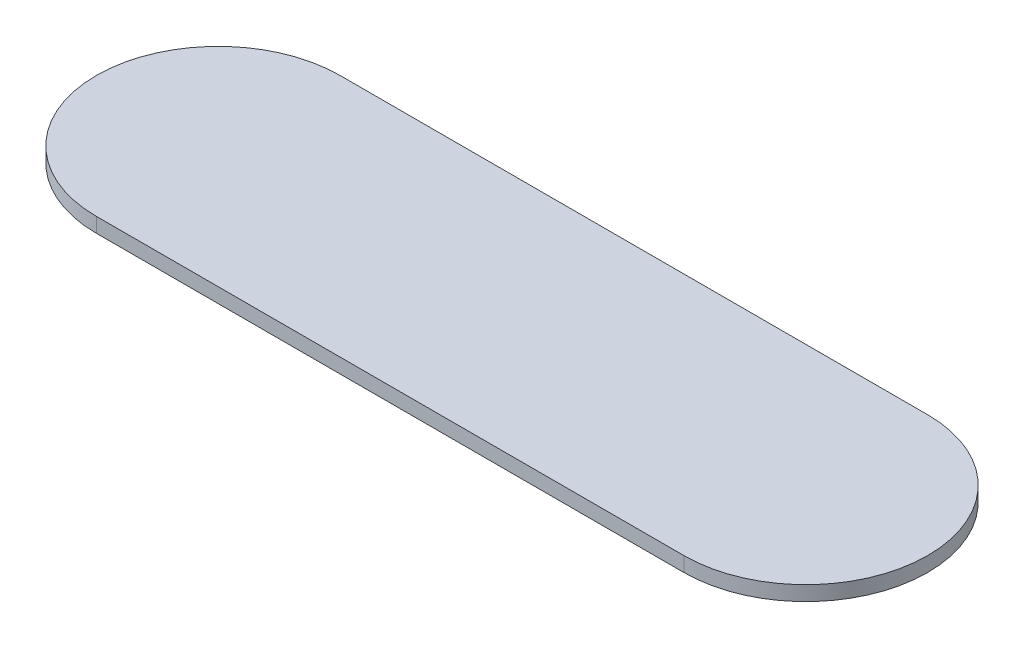
ISO-10303-21;
HEADER;
FILE_DESCRIPTION(('STEP AP214'),'2;1');
FILE_NAME('part.step','',(''),(''),'','','');
FILE_SCHEMA(('AUTOMOTIVE_DESIGN { 1 0 10303 214 1 1 1 1 }'));
ENDSEC;
DATA;
#1=APPLICATION_CONTEXT('core data for automotive mechanical design processes');
#2=APPLICATION_PROTOCOL_DEFINITION('international standard','automotive_design',2000,#1);
#3=PRODUCT_CONTEXT('',#1,'mechanical');
#4=PRODUCT('Part','Part','',(#3));
#5=PRODUCT_RELATED_PRODUCT_CATEGORY('part','',(#4));
#6=PRODUCT_DEFINITION_FORMATION('','',#4);
#7=PRODUCT_DEFINITION_CONTEXT('part definition',#1,'design');
#8=PRODUCT_DEFINITION('design','',#6,#7);
#9=PRODUCT_DEFINITION_SHAPE('','',#8);
#10=(LENGTH_UNIT() NAMED_UNIT(*) SI_UNIT(.MILLI.,.METRE.));
#11=(NAMED_UNIT(*) PLANE_ANGLE_UNIT() SI_UNIT($,.RADIAN.));
#12=(NAMED_UNIT(*) SI_UNIT($,.STERADIAN.) SOLID_ANGLE_UNIT());
#13=UNCERTAINTY_MEASURE_WITH_UNIT(LENGTH_MEASURE(1.E-05),#10,'distance_accuracy_value','');
#14=(GEOMETRIC_REPRESENTATION_CONTEXT(3) GLOBAL_UNCERTAINTY_ASSIGNED_CONTEXT((#13)) GLOBAL_UNIT_ASSIGNED_CONTEXT((#10,
#11,#12)) REPRESENTATION_CONTEXT('',''));
#15=CARTESIAN_POINT('',(0.,0.,0.));
#16=DIRECTION('',(0.,0.,1.));
#17=DIRECTION('',(1.,0.,0.));
#18=AXIS2_PLACEMENT_3D('',#15,#16,#17);
#19=CARTESIAN_POINT('',(0.,2.5,0.));
#20=DIRECTION('',(0.,-1.,0.));
#21=DIRECTION('',(0.,0.,-1.));
#22=AXIS2_PLACEMENT_3D('',#19,#20,#21);
#23=CYLINDRICAL_SURFACE('',#22,20.75);
#24=CARTESIAN_POINT('',(0.,0.,0.));
#25=DIRECTION('',(0.,1.,0.));
#26=DIRECTION('',(0.,0.,1.));
#27=AXIS2_PLACEMENT_3D('',#24,#25,#26);
#28=CIRCLE('',#27,20.75);
#29=CARTESIAN_POINT('',(0.,0.,-20.75));
#30=VERTEX_POINT('',#29);
#31=CARTESIAN_POINT('',(0.,0.,20.75));
#32=VERTEX_POINT('',#31);
#33=EDGE_CURVE('E106',#30,#32,#28,.T.);
#34=ORIENTED_EDGE('',*,*,#33,.T.);
#35=DIRECTION('',(0.,-1.,0.));
#36=VECTOR('',#35,1.);
#37=CARTESIAN_POINT('',(0.,2.5,20.75));
#38=LINE('',#37,#36);
#39=CARTESIAN_POINT('',(0.,2.5,20.75));
#40=VERTEX_POINT('',#39);
#41=EDGE_CURVE('E11',#40,#32,#38,.T.);
#42=ORIENTED_EDGE('',*,*,#41,.F.);
#43=CARTESIAN_POINT('',(0.,2.5,0.));
#44=DIRECTION('',(0.,1.,0.));
#45=DIRECTION('',(0.,0.,1.));
#46=AXIS2_PLACEMENT_3D('',#43,#44,#45);
#47=CIRCLE('',#46,20.75);
#48=CARTESIAN_POINT('',(0.,2.5,-20.75));
#49=VERTEX_POINT('',#48);
#50=EDGE_CURVE('E90',#49,#40,#47,.T.);
#51=ORIENTED_EDGE('',*,*,#50,.F.);
#52=DIRECTION('',(0.,-1.,0.));
#53=VECTOR('',#52,1.);
#54=CARTESIAN_POINT('',(0.,2.5,-20.75));
#55=LINE('',#54,#53);
#56=EDGE_CURVE('E102',#49,#30,#55,.T.);
#57=ORIENTED_EDGE('',*,*,#56,.T.);
#58=EDGE_LOOP('',(#34,#42,#51,#57));
#59=FACE_BOUND('',#58,.T.);
#60=ADVANCED_FACE('F38',(#59),#23,.T.);
#61=CARTESIAN_POINT('',(0.,2.5,20.75));
#62=DIRECTION('',(0.,0.,-1.));
#63=DIRECTION('',(-1.,0.,0.));
#64=AXIS2_PLACEMENT_3D('',#61,#62,#63);
#65=PLANE('',#64);
#66=DIRECTION('',(1.,0.,0.));
#67=VECTOR('',#66,1.);
#68=CARTESIAN_POINT('',(0.,0.,20.75));
#69=LINE('',#68,#67);
#70=CARTESIAN_POINT('',(100.,0.,20.75));
#71=VERTEX_POINT('',#70);
#72=EDGE_CURVE('E95',#32,#71,#69,.T.);
#73=ORIENTED_EDGE('',*,*,#72,.T.);
#74=DIRECTION('',(0.,-1.,0.));
#75=VECTOR('',#74,1.);
#76=CARTESIAN_POINT('',(100.,2.5,20.75));
#77=LINE('',#76,#75);
#78=CARTESIAN_POINT('',(100.,2.5,20.75));
#79=VERTEX_POINT('',#78);
#80=EDGE_CURVE('E47',#79,#71,#77,.T.);
#81=ORIENTED_EDGE('',*,*,#80,.F.);
#82=DIRECTION('',(1.,0.,0.));
#83=VECTOR('',#82,1.);
#84=CARTESIAN_POINT('',(0.,2.5,20.75));
#85=LINE('',#84,#83);
#86=EDGE_CURVE('E85',#40,#79,#85,.T.);
#87=ORIENTED_EDGE('',*,*,#86,.F.);
#88=ORIENTED_EDGE('',*,*,#41,.T.);
#89=EDGE_LOOP('',(#73,#81,#87,#88));
#90=FACE_BOUND('',#89,.T.);
#91=ADVANCED_FACE('F94',(#90),#65,.F.);
#92=CARTESIAN_POINT('',(100.,2.5,0.));
#93=DIRECTION('',(0.,-1.,0.));
#94=DIRECTION('',(0.,0.,-1.));
#95=AXIS2_PLACEMENT_3D('',#92,#93,#94);
#96=CYLINDRICAL_SURFACE('',#95,20.75);
#97=CARTESIAN_POINT('',(100.,0.,0.));
#98=DIRECTION('',(0.,1.,0.));
#99=DIRECTION('',(0.,0.,1.));
#100=AXIS2_PLACEMENT_3D('',#97,#98,#99);
#101=CIRCLE('',#100,20.75);
#102=CARTESIAN_POINT('',(100.,0.,-20.75));
#103=VERTEX_POINT('',#102);
#104=EDGE_CURVE('E72',#71,#103,#101,.T.);
#105=ORIENTED_EDGE('',*,*,#104,.T.);
#106=DIRECTION('',(0.,-1.,0.));
#107=VECTOR('',#106,1.);
#108=CARTESIAN_POINT('',(100.,2.5,-20.75));
#109=LINE('',#108,#107);
#110=CARTESIAN_POINT('',(100.,2.5,-20.75));
#111=VERTEX_POINT('',#110);
#112=EDGE_CURVE('E97',#111,#103,#109,.T.);
#113=ORIENTED_EDGE('',*,*,#112,.F.);
#114=CARTESIAN_POINT('',(100.,2.5,0.));
#115=DIRECTION('',(0.,1.,0.));
#116=DIRECTION('',(0.,0.,1.));
#117=AXIS2_PLACEMENT_3D('',#114,#115,#116);
#118=CIRCLE('',#117,20.75);
#119=EDGE_CURVE('E88',#79,#111,#118,.T.);
#120=ORIENTED_EDGE('',*,*,#119,.F.);
#121=ORIENTED_EDGE('',*,*,#80,.T.);
#122=EDGE_LOOP('',(#105,#113,#120,#121));
#123=FACE_BOUND('',#122,.T.);
#124=ADVANCED_FACE('F98',(#123),#96,.T.);
#125=CARTESIAN_POINT('',(0.,2.5,-20.75));
#126=DIRECTION('',(0.,0.,1.));
#127=DIRECTION('',(1.,0.,0.));
#128=AXIS2_PLACEMENT_3D('',#125,#126,#127);
#129=PLANE('',#128);
#130=DIRECTION('',(-1.,0.,0.));
#131=VECTOR('',#130,1.);
#132=CARTESIAN_POINT('',(0.,0.,-20.75));
#133=LINE('',#132,#131);
#134=EDGE_CURVE('E78',#103,#30,#133,.T.);
#135=ORIENTED_EDGE('',*,*,#134,.T.);
#136=ORIENTED_EDGE('',*,*,#56,.F.);
#137=DIRECTION('',(-1.,0.,0.));
#138=VECTOR('',#137,1.);
#139=CARTESIAN_POINT('',(0.,2.5,-20.75));
#140=LINE('',#139,#138);
#141=EDGE_CURVE('E55',#111,#49,#140,.T.);
#142=ORIENTED_EDGE('',*,*,#141,.F.);
#143=ORIENTED_EDGE('',*,*,#112,.T.);
#144=EDGE_LOOP('',(#135,#136,#142,#143));
#145=FACE_BOUND('',#144,.T.);
#146=ADVANCED_FACE('F120',(#145),#129,.F.);
#147=CARTESIAN_POINT('',(0.,2.5,0.));
#148=DIRECTION('',(0.,1.,0.));
#149=DIRECTION('',(0.,0.,1.));
#150=AXIS2_PLACEMENT_3D('',#147,#148,#149);
#151=PLANE('',#150);
#152=ORIENTED_EDGE('',*,*,#50,.T.);
#153=ORIENTED_EDGE('',*,*,#86,.T.);
#154=ORIENTED_EDGE('',*,*,#119,.T.);
#155=ORIENTED_EDGE('',*,*,#141,.T.);
#156=EDGE_LOOP('',(#152,#153,#154,#155));
#157=FACE_BOUND('',#156,.T.);
#158=ADVANCED_FACE('F86',(#157),#151,.T.);
#159=CARTESIAN_POINT('',(0.,0.,0.));
#160=DIRECTION('',(0.,1.,0.));
#161=DIRECTION('',(0.,0.,1.));
#162=AXIS2_PLACEMENT_3D('',#159,#160,#161);
#163=PLANE('',#162);
#164=CARTESIAN_POINT('',(35.,0.,0.));
#165=DIRECTION('',(0.,-1.,0.));
#166=DIRECTION('',(0.,0.,-1.));
#167=AXIS2_PLACEMENT_3D('',#164,#165,#166);
#168=CIRCLE('',#167,6.25);
#169=CARTESIAN_POINT('',(35.,0.,-6.25));
#170=VERTEX_POINT('',#169);
#171=EDGE_CURVE('E135',#170,#170,#168,.T.);
#172=ORIENTED_EDGE('',*,*,#171,.F.);
#173=EDGE_LOOP('',(#172));
#174=FACE_BOUND('',#173,.T.);
#175=CARTESIAN_POINT('',(65.,0.,0.));
#176=DIRECTION('',(0.,-1.,0.));
#177=DIRECTION('',(0.,0.,-1.));
#178=AXIS2_PLACEMENT_3D('',#175,#176,#177);
#179=CIRCLE('',#178,6.25);
#180=CARTESIAN_POINT('',(65.,0.,-6.25));
#181=VERTEX_POINT('',#180);
#182=EDGE_CURVE('E127',#181,#181,#179,.T.);
#183=ORIENTED_EDGE('',*,*,#182,.F.);
#184=EDGE_LOOP('',(#183));
#185=FACE_BOUND('',#184,.T.);
#186=ORIENTED_EDGE('',*,*,#33,.F.);
#187=ORIENTED_EDGE('',*,*,#134,.F.);
#188=ORIENTED_EDGE('',*,*,#104,.F.);
#189=ORIENTED_EDGE('',*,*,#72,.F.);
#190=EDGE_LOOP('',(#186,#187,#188,#189));
#191=FACE_BOUND('',#190,.T.);
#192=ADVANCED_FACE('F123',(#174,#185,#191),#163,.F.);
#193=CARTESIAN_POINT('',(65.,1.,0.));
#194=DIRECTION('',(0.,-1.,0.));
#195=DIRECTION('',(0.,0.,-1.));
#196=AXIS2_PLACEMENT_3D('',#193,#194,#195);
#197=CYLINDRICAL_SURFACE('',#196,6.25);
#198=CARTESIAN_POINT('',(65.,1.,0.));
#199=DIRECTION('',(0.,-1.,0.));
#200=DIRECTION('',(0.,0.,-1.));
#201=AXIS2_PLACEMENT_3D('',#198,#199,#200);
#202=CIRCLE('',#201,6.25);
#203=CARTESIAN_POINT('',(65.,1.,-6.25));
#204=VERTEX_POINT('',#203);
#205=EDGE_CURVE('E131',#204,#204,#202,.T.);
#206=ORIENTED_EDGE('',*,*,#205,.F.);
#207=EDGE_LOOP('',(#206));
#208=FACE_BOUND('',#207,.T.);
#209=ORIENTED_EDGE('',*,*,#182,.T.);
#210=EDGE_LOOP('',(#209));
#211=FACE_BOUND('',#210,.T.);
#212=ADVANCED_FACE('F154',(#208,#211),#197,.F.);
#213=CARTESIAN_POINT('',(65.,1.,0.));
#214=DIRECTION('',(0.,-1.,0.));
#215=DIRECTION('',(0.,0.,-1.));
#216=AXIS2_PLACEMENT_3D('',#213,#214,#215);
#217=PLANE('',#216);
#218=ORIENTED_EDGE('',*,*,#205,.T.);
#219=EDGE_LOOP('',(#218));
#220=FACE_BOUND('',#219,.T.);
#221=ADVANCED_FACE('F148',(#220),#217,.T.);
#222=CARTESIAN_POINT('',(35.,1.,0.));
#223=DIRECTION('',(0.,-1.,0.));
#224=DIRECTION('',(0.,0.,-1.));
#225=AXIS2_PLACEMENT_3D('',#222,#223,#224);
#226=CYLINDRICAL_SURFACE('',#225,6.25);
#227=CARTESIAN_POINT('',(35.,1.,0.));
#228=DIRECTION('',(0.,-1.,0.));
#229=DIRECTION('',(0.,0.,-1.));
#230=AXIS2_PLACEMENT_3D('',#227,#228,#229);
#231=CIRCLE('',#230,6.25);
#232=CARTESIAN_POINT('',(35.,1.,-6.25));
#233=VERTEX_POINT('',#232);
#234=EDGE_CURVE('E110',#233,#233,#231,.T.);
#235=ORIENTED_EDGE('',*,*,#234,.F.);
#236=EDGE_LOOP('',(#235));
#237=FACE_BOUND('',#236,.T.);
#238=ORIENTED_EDGE('',*,*,#171,.T.);
#239=EDGE_LOOP('',(#238));
#240=FACE_BOUND('',#239,.T.);
#241=ADVANCED_FACE('F145',(#237,#240),#226,.F.);
#242=CARTESIAN_POINT('',(35.,1.,0.));
#243=DIRECTION('',(0.,-1.,0.));
#244=DIRECTION('',(0.,0.,-1.));
#245=AXIS2_PLACEMENT_3D('',#242,#243,#244);
#246=PLANE('',#245);
#247=ORIENTED_EDGE('',*,*,#234,.T.);
#248=EDGE_LOOP('',(#247));
#249=FACE_BOUND('',#248,.T.);
#250=ADVANCED_FACE('F143',(#249),#246,.T.);
#251=CLOSED_SHELL('',(#60,#91,#124,#146,#158,#192,#212,#221,#241,#250));
#252=MANIFOLD_SOLID_BREP('B2',#251);
#253=ADVANCED_BREP_SHAPE_REPRESENTATION('',(#18,#252),#14);
#254=SHAPE_DEFINITION_REPRESENTATION(#9,#253);
ENDSEC;
END-ISO-10303-21;
